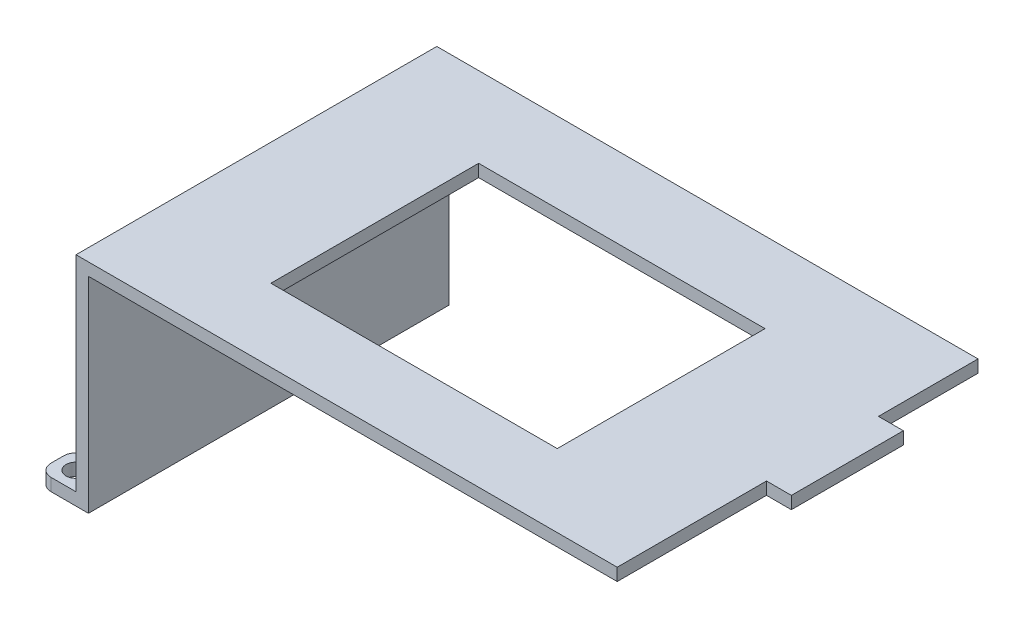
ISO-10303-21;
HEADER;
FILE_DESCRIPTION(('STEP AP214'),'2;1');
FILE_NAME('part.step','',(''),(''),'','','');
FILE_SCHEMA(('AUTOMOTIVE_DESIGN { 1 0 10303 214 1 1 1 1 }'));
ENDSEC;
DATA;
#1=APPLICATION_CONTEXT('core data for automotive mechanical design processes');
#2=APPLICATION_PROTOCOL_DEFINITION('international standard','automotive_design',2000,#1);
#3=PRODUCT_CONTEXT('',#1,'mechanical');
#4=PRODUCT('Part','Part','',(#3));
#5=PRODUCT_RELATED_PRODUCT_CATEGORY('part','',(#4));
#6=PRODUCT_DEFINITION_FORMATION('','',#4);
#7=PRODUCT_DEFINITION_CONTEXT('part definition',#1,'design');
#8=PRODUCT_DEFINITION('design','',#6,#7);
#9=PRODUCT_DEFINITION_SHAPE('','',#8);
#10=(LENGTH_UNIT() NAMED_UNIT(*) SI_UNIT(.MILLI.,.METRE.));
#11=(NAMED_UNIT(*) PLANE_ANGLE_UNIT() SI_UNIT($,.RADIAN.));
#12=(NAMED_UNIT(*) SI_UNIT($,.STERADIAN.) SOLID_ANGLE_UNIT());
#13=UNCERTAINTY_MEASURE_WITH_UNIT(LENGTH_MEASURE(1.E-05),#10,'distance_accuracy_value','');
#14=(GEOMETRIC_REPRESENTATION_CONTEXT(3) GLOBAL_UNCERTAINTY_ASSIGNED_CONTEXT((#13)) GLOBAL_UNIT_ASSIGNED_CONTEXT((#10,
#11,#12)) REPRESENTATION_CONTEXT('',''));
#15=CARTESIAN_POINT('',(0.,0.,0.));
#16=DIRECTION('',(0.,0.,1.));
#17=DIRECTION('',(1.,0.,0.));
#18=AXIS2_PLACEMENT_3D('',#15,#16,#17);
#19=CARTESIAN_POINT('',(-43.5,2.,0.));
#20=DIRECTION('',(-1.,0.,0.));
#21=DIRECTION('',(0.,0.,1.));
#22=AXIS2_PLACEMENT_3D('',#19,#20,#21);
#23=PLANE('',#22);
#24=DIRECTION('',(0.,-1.,0.));
#25=VECTOR('',#24,1.);
#26=CARTESIAN_POINT('',(-43.5,-31.,-23.));
#27=LINE('',#26,#25);
#28=CARTESIAN_POINT('',(-43.5,-31.,-23.));
#29=VERTEX_POINT('',#28);
#30=CARTESIAN_POINT('',(-43.5,-33.,-23.));
#31=VERTEX_POINT('',#30);
#32=EDGE_CURVE('E273',#29,#31,#27,.T.);
#33=ORIENTED_EDGE('',*,*,#32,.T.);
#34=DIRECTION('',(0.,0.,-1.));
#35=VECTOR('',#34,1.);
#36=CARTESIAN_POINT('',(-43.5,-33.,0.));
#37=LINE('',#36,#35);
#38=CARTESIAN_POINT('',(-43.5,-33.,23.));
#39=VERTEX_POINT('',#38);
#40=EDGE_CURVE('E339',#39,#31,#37,.T.);
#41=ORIENTED_EDGE('',*,*,#40,.F.);
#42=DIRECTION('',(0.,-1.,0.));
#43=VECTOR('',#42,1.);
#44=CARTESIAN_POINT('',(-43.5,-31.,23.));
#45=LINE('',#44,#43);
#46=CARTESIAN_POINT('',(-43.5,-31.,23.));
#47=VERTEX_POINT('',#46);
#48=EDGE_CURVE('E321',#47,#39,#45,.T.);
#49=ORIENTED_EDGE('',*,*,#48,.F.);
#50=DIRECTION('',(0.,0.,-1.));
#51=VECTOR('',#50,1.);
#52=CARTESIAN_POINT('',(-43.5,-31.,0.));
#53=LINE('',#52,#51);
#54=CARTESIAN_POINT('',(-43.5,-31.,29.));
#55=VERTEX_POINT('',#54);
#56=EDGE_CURVE('E304',#55,#47,#53,.T.);
#57=ORIENTED_EDGE('',*,*,#56,.F.);
#58=DIRECTION('',(0.,-1.,0.));
#59=VECTOR('',#58,1.);
#60=CARTESIAN_POINT('',(-43.5,2.,29.));
#61=LINE('',#60,#59);
#62=CARTESIAN_POINT('',(-43.5,2.,29.));
#63=VERTEX_POINT('',#62);
#64=EDGE_CURVE('E11',#63,#55,#61,.T.);
#65=ORIENTED_EDGE('',*,*,#64,.F.);
#66=DIRECTION('',(0.,0.,-1.));
#67=VECTOR('',#66,1.);
#68=CARTESIAN_POINT('',(-43.5,2.,0.));
#69=LINE('',#68,#67);
#70=CARTESIAN_POINT('',(-43.5,2.,-29.));
#71=VERTEX_POINT('',#70);
#72=EDGE_CURVE('E351',#63,#71,#69,.T.);
#73=ORIENTED_EDGE('',*,*,#72,.T.);
#74=DIRECTION('',(0.,-1.,0.));
#75=VECTOR('',#74,1.);
#76=CARTESIAN_POINT('',(-43.5,2.,-29.));
#77=LINE('',#76,#75);
#78=CARTESIAN_POINT('',(-43.5,-31.,-29.));
#79=VERTEX_POINT('',#78);
#80=EDGE_CURVE('E371',#71,#79,#77,.T.);
#81=ORIENTED_EDGE('',*,*,#80,.T.);
#82=DIRECTION('',(0.,0.,-1.));
#83=VECTOR('',#82,1.);
#84=CARTESIAN_POINT('',(-43.5,-31.,0.));
#85=LINE('',#84,#83);
#86=EDGE_CURVE('E256',#29,#79,#85,.T.);
#87=ORIENTED_EDGE('',*,*,#86,.F.);
#88=EDGE_LOOP('',(#33,#41,#49,#57,#65,#73,#81,#87));
#89=FACE_BOUND('',#88,.T.);
#90=ADVANCED_FACE('F41',(#89),#23,.T.);
#91=CARTESIAN_POINT('',(0.,2.,29.));
#92=DIRECTION('',(0.,0.,1.));
#93=DIRECTION('',(1.,0.,0.));
#94=AXIS2_PLACEMENT_3D('',#91,#92,#93);
#95=PLANE('',#94);
#96=DIRECTION('',(-1.,0.,0.));
#97=VECTOR('',#96,1.);
#98=CARTESIAN_POINT('',(0.,0.,29.));
#99=LINE('',#98,#97);
#100=CARTESIAN_POINT('',(43.5,0.,29.));
#101=VERTEX_POINT('',#100);
#102=CARTESIAN_POINT('',(-41.5,0.,29.));
#103=VERTEX_POINT('',#102);
#104=EDGE_CURVE('E350',#101,#103,#99,.T.);
#105=ORIENTED_EDGE('',*,*,#104,.F.);
#106=DIRECTION('',(0.,-1.,0.));
#107=VECTOR('',#106,1.);
#108=CARTESIAN_POINT('',(43.5,2.,29.));
#109=LINE('',#108,#107);
#110=CARTESIAN_POINT('',(43.5,2.,29.));
#111=VERTEX_POINT('',#110);
#112=EDGE_CURVE('E48',#111,#101,#109,.T.);
#113=ORIENTED_EDGE('',*,*,#112,.F.);
#114=DIRECTION('',(-1.,0.,0.));
#115=VECTOR('',#114,1.);
#116=CARTESIAN_POINT('',(0.,2.,29.));
#117=LINE('',#116,#115);
#118=EDGE_CURVE('E354',#111,#63,#117,.T.);
#119=ORIENTED_EDGE('',*,*,#118,.T.);
#120=ORIENTED_EDGE('',*,*,#64,.T.);
#121=DIRECTION('',(-1.,0.,0.));
#122=VECTOR('',#121,1.);
#123=CARTESIAN_POINT('',(0.,-31.,29.));
#124=LINE('',#123,#122);
#125=CARTESIAN_POINT('',(-47.5,-31.,29.));
#126=VERTEX_POINT('',#125);
#127=EDGE_CURVE('E289',#55,#126,#124,.T.);
#128=ORIENTED_EDGE('',*,*,#127,.T.);
#129=DIRECTION('',(0.,-1.,0.));
#130=VECTOR('',#129,1.);
#131=CARTESIAN_POINT('',(-47.5,-31.,29.));
#132=LINE('',#131,#130);
#133=CARTESIAN_POINT('',(-47.5,-33.,29.));
#134=VERTEX_POINT('',#133);
#135=EDGE_CURVE('E307',#126,#134,#132,.T.);
#136=ORIENTED_EDGE('',*,*,#135,.T.);
#137=DIRECTION('',(-1.,0.,0.));
#138=VECTOR('',#137,1.);
#139=CARTESIAN_POINT('',(0.,-33.,29.));
#140=LINE('',#139,#138);
#141=CARTESIAN_POINT('',(-41.5,-33.,29.));
#142=VERTEX_POINT('',#141);
#143=EDGE_CURVE('E337',#142,#134,#140,.T.);
#144=ORIENTED_EDGE('',*,*,#143,.F.);
#145=DIRECTION('',(0.,1.,0.));
#146=VECTOR('',#145,1.);
#147=CARTESIAN_POINT('',(-41.5,-33.,29.));
#148=LINE('',#147,#146);
#149=EDGE_CURVE('E348',#142,#103,#148,.T.);
#150=ORIENTED_EDGE('',*,*,#149,.T.);
#151=EDGE_LOOP('',(#105,#113,#119,#120,#128,#136,#144,#150));
#152=FACE_BOUND('',#151,.T.);
#153=ADVANCED_FACE('F410',(#152),#95,.T.);
#154=CARTESIAN_POINT('',(43.5,2.,0.));
#155=DIRECTION('',(-1.,0.,0.));
#156=DIRECTION('',(0.,0.,1.));
#157=AXIS2_PLACEMENT_3D('',#154,#155,#156);
#158=PLANE('',#157);
#159=DIRECTION('',(0.,0.,-1.));
#160=VECTOR('',#159,1.);
#161=CARTESIAN_POINT('',(43.5,0.,0.));
#162=LINE('',#161,#160);
#163=CARTESIAN_POINT('',(43.5,0.,5.00000000000002));
#164=VERTEX_POINT('',#163);
#165=EDGE_CURVE('E374',#101,#164,#162,.T.);
#166=ORIENTED_EDGE('',*,*,#165,.T.);
#167=DIRECTION('',(0.,-1.,0.));
#168=VECTOR('',#167,1.);
#169=CARTESIAN_POINT('',(43.5,2.,5.00000000000002));
#170=LINE('',#169,#168);
#171=CARTESIAN_POINT('',(43.5,2.,5.00000000000002));
#172=VERTEX_POINT('',#171);
#173=EDGE_CURVE('E399',#172,#164,#170,.T.);
#174=ORIENTED_EDGE('',*,*,#173,.F.);
#175=DIRECTION('',(0.,0.,-1.));
#176=VECTOR('',#175,1.);
#177=CARTESIAN_POINT('',(43.5,2.,0.));
#178=LINE('',#177,#176);
#179=EDGE_CURVE('E358',#111,#172,#178,.T.);
#180=ORIENTED_EDGE('',*,*,#179,.F.);
#181=ORIENTED_EDGE('',*,*,#112,.T.);
#182=EDGE_LOOP('',(#166,#174,#180,#181));
#183=FACE_BOUND('',#182,.T.);
#184=ADVANCED_FACE('F404',(#183),#158,.F.);
#185=CARTESIAN_POINT('',(0.,2.,5.00000000000002));
#186=DIRECTION('',(0.,0.,-1.));
#187=DIRECTION('',(-1.,0.,0.));
#188=AXIS2_PLACEMENT_3D('',#185,#186,#187);
#189=PLANE('',#188);
#190=DIRECTION('',(1.,0.,0.));
#191=VECTOR('',#190,1.);
#192=CARTESIAN_POINT('',(0.,0.,5.00000000000002));
#193=LINE('',#192,#191);
#194=CARTESIAN_POINT('',(47.5,0.,5.00000000000002));
#195=VERTEX_POINT('',#194);
#196=EDGE_CURVE('E376',#164,#195,#193,.T.);
#197=ORIENTED_EDGE('',*,*,#196,.T.);
#198=DIRECTION('',(0.,-1.,0.));
#199=VECTOR('',#198,1.);
#200=CARTESIAN_POINT('',(47.5,2.,5.00000000000002));
#201=LINE('',#200,#199);
#202=CARTESIAN_POINT('',(47.5,2.,5.00000000000002));
#203=VERTEX_POINT('',#202);
#204=EDGE_CURVE('E397',#203,#195,#201,.T.);
#205=ORIENTED_EDGE('',*,*,#204,.F.);
#206=DIRECTION('',(1.,0.,0.));
#207=VECTOR('',#206,1.);
#208=CARTESIAN_POINT('',(0.,2.,5.00000000000002));
#209=LINE('',#208,#207);
#210=EDGE_CURVE('E360',#172,#203,#209,.T.);
#211=ORIENTED_EDGE('',*,*,#210,.F.);
#212=ORIENTED_EDGE('',*,*,#173,.T.);
#213=EDGE_LOOP('',(#197,#205,#211,#212));
#214=FACE_BOUND('',#213,.T.);
#215=ADVANCED_FACE('F438',(#214),#189,.F.);
#216=CARTESIAN_POINT('',(47.5,2.,0.));
#217=DIRECTION('',(1.,0.,0.));
#218=DIRECTION('',(0.,0.,-1.));
#219=AXIS2_PLACEMENT_3D('',#216,#217,#218);
#220=PLANE('',#219);
#221=DIRECTION('',(0.,0.,1.));
#222=VECTOR('',#221,1.);
#223=CARTESIAN_POINT('',(47.5,0.,0.));
#224=LINE('',#223,#222);
#225=CARTESIAN_POINT('',(47.5,0.,-13.));
#226=VERTEX_POINT('',#225);
#227=EDGE_CURVE('E380',#226,#195,#224,.T.);
#228=ORIENTED_EDGE('',*,*,#227,.F.);
#229=DIRECTION('',(0.,-1.,0.));
#230=VECTOR('',#229,1.);
#231=CARTESIAN_POINT('',(47.5,2.,-13.));
#232=LINE('',#231,#230);
#233=CARTESIAN_POINT('',(47.5,2.,-13.));
#234=VERTEX_POINT('',#233);
#235=EDGE_CURVE('E395',#234,#226,#232,.T.);
#236=ORIENTED_EDGE('',*,*,#235,.F.);
#237=DIRECTION('',(0.,0.,1.));
#238=VECTOR('',#237,1.);
#239=CARTESIAN_POINT('',(47.5,2.,0.));
#240=LINE('',#239,#238);
#241=EDGE_CURVE('E363',#234,#203,#240,.T.);
#242=ORIENTED_EDGE('',*,*,#241,.T.);
#243=ORIENTED_EDGE('',*,*,#204,.T.);
#244=EDGE_LOOP('',(#228,#236,#242,#243));
#245=FACE_BOUND('',#244,.T.);
#246=ADVANCED_FACE('F434',(#245),#220,.T.);
#247=CARTESIAN_POINT('',(0.,2.,-13.));
#248=DIRECTION('',(0.,0.,-1.));
#249=DIRECTION('',(-1.,0.,0.));
#250=AXIS2_PLACEMENT_3D('',#247,#248,#249);
#251=PLANE('',#250);
#252=DIRECTION('',(1.,0.,0.));
#253=VECTOR('',#252,1.);
#254=CARTESIAN_POINT('',(0.,0.,-13.));
#255=LINE('',#254,#253);
#256=CARTESIAN_POINT('',(43.5,0.,-13.));
#257=VERTEX_POINT('',#256);
#258=EDGE_CURVE('E383',#257,#226,#255,.T.);
#259=ORIENTED_EDGE('',*,*,#258,.F.);
#260=DIRECTION('',(0.,-1.,0.));
#261=VECTOR('',#260,1.);
#262=CARTESIAN_POINT('',(43.5,2.,-13.));
#263=LINE('',#262,#261);
#264=CARTESIAN_POINT('',(43.5,2.,-13.));
#265=VERTEX_POINT('',#264);
#266=EDGE_CURVE('E393',#265,#257,#263,.T.);
#267=ORIENTED_EDGE('',*,*,#266,.F.);
#268=DIRECTION('',(1.,0.,0.));
#269=VECTOR('',#268,1.);
#270=CARTESIAN_POINT('',(0.,2.,-13.));
#271=LINE('',#270,#269);
#272=EDGE_CURVE('E366',#265,#234,#271,.T.);
#273=ORIENTED_EDGE('',*,*,#272,.T.);
#274=ORIENTED_EDGE('',*,*,#235,.T.);
#275=EDGE_LOOP('',(#259,#267,#273,#274));
#276=FACE_BOUND('',#275,.T.);
#277=ADVANCED_FACE('F430',(#276),#251,.T.);
#278=CARTESIAN_POINT('',(43.5,0.,-29.));
#279=VERTEX_POINT('',#278);
#280=EDGE_CURVE('E377',#257,#279,#162,.T.);
#281=ORIENTED_EDGE('',*,*,#280,.T.);
#282=DIRECTION('',(0.,-1.,0.));
#283=VECTOR('',#282,1.);
#284=CARTESIAN_POINT('',(43.5,2.,-29.));
#285=LINE('',#284,#283);
#286=CARTESIAN_POINT('',(43.5,2.,-29.));
#287=VERTEX_POINT('',#286);
#288=EDGE_CURVE('E390',#287,#279,#285,.T.);
#289=ORIENTED_EDGE('',*,*,#288,.F.);
#290=EDGE_CURVE('E361',#265,#287,#178,.T.);
#291=ORIENTED_EDGE('',*,*,#290,.F.);
#292=ORIENTED_EDGE('',*,*,#266,.T.);
#293=EDGE_LOOP('',(#281,#289,#291,#292));
#294=FACE_BOUND('',#293,.T.);
#295=ADVANCED_FACE('F426',(#294),#158,.F.);
#296=CARTESIAN_POINT('',(0.,2.,-29.));
#297=DIRECTION('',(0.,0.,1.));
#298=DIRECTION('',(1.,0.,0.));
#299=AXIS2_PLACEMENT_3D('',#296,#297,#298);
#300=PLANE('',#299);
#301=DIRECTION('',(-1.,0.,0.));
#302=VECTOR('',#301,1.);
#303=CARTESIAN_POINT('',(0.,0.,-29.));
#304=LINE('',#303,#302);
#305=CARTESIAN_POINT('',(-41.5,0.,-29.));
#306=VERTEX_POINT('',#305);
#307=EDGE_CURVE('E355',#279,#306,#304,.T.);
#308=ORIENTED_EDGE('',*,*,#307,.T.);
#309=DIRECTION('',(0.,1.,0.));
#310=VECTOR('',#309,1.);
#311=CARTESIAN_POINT('',(-41.5,-33.,-29.));
#312=LINE('',#311,#310);
#313=CARTESIAN_POINT('',(-41.5,-33.,-29.));
#314=VERTEX_POINT('',#313);
#315=EDGE_CURVE('E344',#314,#306,#312,.T.);
#316=ORIENTED_EDGE('',*,*,#315,.F.);
#317=DIRECTION('',(1.,0.,0.));
#318=VECTOR('',#317,1.);
#319=CARTESIAN_POINT('',(0.,-33.,-29.));
#320=LINE('',#319,#318);
#321=CARTESIAN_POINT('',(-47.5,-33.,-29.));
#322=VERTEX_POINT('',#321);
#323=EDGE_CURVE('E342',#322,#314,#320,.T.);
#324=ORIENTED_EDGE('',*,*,#323,.F.);
#325=DIRECTION('',(0.,-1.,0.));
#326=VECTOR('',#325,1.);
#327=CARTESIAN_POINT('',(-47.5,-31.,-29.));
#328=LINE('',#327,#326);
#329=CARTESIAN_POINT('',(-47.5,-31.,-29.));
#330=VERTEX_POINT('',#329);
#331=EDGE_CURVE('E277',#330,#322,#328,.T.);
#332=ORIENTED_EDGE('',*,*,#331,.F.);
#333=DIRECTION('',(-1.,0.,0.));
#334=VECTOR('',#333,1.);
#335=CARTESIAN_POINT('',(0.,-31.,-29.));
#336=LINE('',#335,#334);
#337=EDGE_CURVE('E253',#79,#330,#336,.T.);
#338=ORIENTED_EDGE('',*,*,#337,.F.);
#339=ORIENTED_EDGE('',*,*,#80,.F.);
#340=DIRECTION('',(-1.,0.,0.));
#341=VECTOR('',#340,1.);
#342=CARTESIAN_POINT('',(0.,2.,-29.));
#343=LINE('',#342,#341);
#344=EDGE_CURVE('E369',#287,#71,#343,.T.);
#345=ORIENTED_EDGE('',*,*,#344,.F.);
#346=ORIENTED_EDGE('',*,*,#288,.T.);
#347=EDGE_LOOP('',(#308,#316,#324,#332,#338,#339,#345,#346));
#348=FACE_BOUND('',#347,.T.);
#349=ADVANCED_FACE('F420',(#348),#300,.F.);
#350=CARTESIAN_POINT('',(0.,2.,0.));
#351=DIRECTION('',(0.,1.,0.));
#352=DIRECTION('',(0.,0.,1.));
#353=AXIS2_PLACEMENT_3D('',#350,#351,#352);
#354=PLANE('',#353);
#355=DIRECTION('',(0.,0.,1.));
#356=VECTOR('',#355,1.);
#357=CARTESIAN_POINT('',(-23.8691579893384,2.,17.3035636733516));
#358=LINE('',#357,#356);
#359=CARTESIAN_POINT('',(-23.8691579893384,2.,-16.0934126312213));
#360=VERTEX_POINT('',#359);
#361=CARTESIAN_POINT('',(-23.8691579893384,2.,17.3035636733516));
#362=VERTEX_POINT('',#361);
#363=EDGE_CURVE('E55',#360,#362,#358,.T.);
#364=ORIENTED_EDGE('',*,*,#363,.F.);
#365=DIRECTION('',(-1.,0.,0.));
#366=VECTOR('',#365,1.);
#367=CARTESIAN_POINT('',(-23.8691579893384,2.,-16.0934126312213));
#368=LINE('',#367,#366);
#369=CARTESIAN_POINT('',(22.1689913647083,2.,-16.0934126312213));
#370=VERTEX_POINT('',#369);
#371=EDGE_CURVE('E209',#370,#360,#368,.T.);
#372=ORIENTED_EDGE('',*,*,#371,.F.);
#373=DIRECTION('',(0.,0.,-1.));
#374=VECTOR('',#373,1.);
#375=CARTESIAN_POINT('',(22.1689913647083,2.,17.3035636733516));
#376=LINE('',#375,#374);
#377=CARTESIAN_POINT('',(22.1689913647083,2.,17.3035636733516));
#378=VERTEX_POINT('',#377);
#379=EDGE_CURVE('E229',#378,#370,#376,.T.);
#380=ORIENTED_EDGE('',*,*,#379,.F.);
#381=DIRECTION('',(1.,0.,0.));
#382=VECTOR('',#381,1.);
#383=CARTESIAN_POINT('',(-23.8691579893384,2.,17.3035636733516));
#384=LINE('',#383,#382);
#385=EDGE_CURVE('E223',#362,#378,#384,.T.);
#386=ORIENTED_EDGE('',*,*,#385,.F.);
#387=EDGE_LOOP('',(#364,#372,#380,#386));
#388=FACE_BOUND('',#387,.T.);
#389=ORIENTED_EDGE('',*,*,#72,.F.);
#390=ORIENTED_EDGE('',*,*,#118,.F.);
#391=ORIENTED_EDGE('',*,*,#179,.T.);
#392=ORIENTED_EDGE('',*,*,#210,.T.);
#393=ORIENTED_EDGE('',*,*,#241,.F.);
#394=ORIENTED_EDGE('',*,*,#272,.F.);
#395=ORIENTED_EDGE('',*,*,#290,.T.);
#396=ORIENTED_EDGE('',*,*,#344,.T.);
#397=EDGE_LOOP('',(#389,#390,#391,#392,#393,#394,#395,#396));
#398=FACE_BOUND('',#397,.T.);
#399=ADVANCED_FACE('F441',(#388,#398),#354,.T.);
#400=CARTESIAN_POINT('',(0.,0.,0.));
#401=DIRECTION('',(0.,1.,0.));
#402=DIRECTION('',(0.,0.,1.));
#403=AXIS2_PLACEMENT_3D('',#400,#401,#402);
#404=PLANE('',#403);
#405=DIRECTION('',(1.,0.,0.));
#406=VECTOR('',#405,1.);
#407=CARTESIAN_POINT('',(-23.8691579893384,0.,-16.0934126312213));
#408=LINE('',#407,#406);
#409=CARTESIAN_POINT('',(-23.8691579893384,0.,-16.0934126312213));
#410=VERTEX_POINT('',#409);
#411=CARTESIAN_POINT('',(22.1689913647083,0.,-16.0934126312213));
#412=VERTEX_POINT('',#411);
#413=EDGE_CURVE('E221',#410,#412,#408,.T.);
#414=ORIENTED_EDGE('',*,*,#413,.F.);
#415=DIRECTION('',(0.,0.,-1.));
#416=VECTOR('',#415,1.);
#417=CARTESIAN_POINT('',(-23.8691579893384,0.,17.3035636733516));
#418=LINE('',#417,#416);
#419=CARTESIAN_POINT('',(-23.8691579893384,0.,17.3035636733516));
#420=VERTEX_POINT('',#419);
#421=EDGE_CURVE('E203',#420,#410,#418,.T.);
#422=ORIENTED_EDGE('',*,*,#421,.F.);
#423=DIRECTION('',(-1.,0.,0.));
#424=VECTOR('',#423,1.);
#425=CARTESIAN_POINT('',(-23.8691579893384,0.,17.3035636733516));
#426=LINE('',#425,#424);
#427=CARTESIAN_POINT('',(22.1689913647083,0.,17.3035636733516));
#428=VERTEX_POINT('',#427);
#429=EDGE_CURVE('E212',#428,#420,#426,.T.);
#430=ORIENTED_EDGE('',*,*,#429,.F.);
#431=DIRECTION('',(0.,0.,1.));
#432=VECTOR('',#431,1.);
#433=CARTESIAN_POINT('',(22.1689913647083,0.,17.3035636733516));
#434=LINE('',#433,#432);
#435=EDGE_CURVE('E63',#412,#428,#434,.T.);
#436=ORIENTED_EDGE('',*,*,#435,.F.);
#437=EDGE_LOOP('',(#414,#422,#430,#436));
#438=FACE_BOUND('',#437,.T.);
#439=ORIENTED_EDGE('',*,*,#104,.T.);
#440=DIRECTION('',(0.,0.,-1.));
#441=VECTOR('',#440,1.);
#442=CARTESIAN_POINT('',(-41.5,0.,0.));
#443=LINE('',#442,#441);
#444=EDGE_CURVE('E324',#103,#306,#443,.T.);
#445=ORIENTED_EDGE('',*,*,#444,.T.);
#446=ORIENTED_EDGE('',*,*,#307,.F.);
#447=ORIENTED_EDGE('',*,*,#280,.F.);
#448=ORIENTED_EDGE('',*,*,#258,.T.);
#449=ORIENTED_EDGE('',*,*,#227,.T.);
#450=ORIENTED_EDGE('',*,*,#196,.F.);
#451=ORIENTED_EDGE('',*,*,#165,.F.);
#452=EDGE_LOOP('',(#439,#445,#446,#447,#448,#449,#450,#451));
#453=FACE_BOUND('',#452,.T.);
#454=ADVANCED_FACE('F218',(#438,#453),#404,.F.);
#455=CARTESIAN_POINT('',(-41.5,-33.,0.));
#456=DIRECTION('',(1.,0.,0.));
#457=DIRECTION('',(0.,0.,-1.));
#458=AXIS2_PLACEMENT_3D('',#455,#456,#457);
#459=PLANE('',#458);
#460=ORIENTED_EDGE('',*,*,#444,.F.);
#461=ORIENTED_EDGE('',*,*,#149,.F.);
#462=DIRECTION('',(0.,0.,-1.));
#463=VECTOR('',#462,1.);
#464=CARTESIAN_POINT('',(-41.5,-33.,0.));
#465=LINE('',#464,#463);
#466=EDGE_CURVE('E334',#142,#314,#465,.T.);
#467=ORIENTED_EDGE('',*,*,#466,.T.);
#468=ORIENTED_EDGE('',*,*,#315,.T.);
#469=EDGE_LOOP('',(#460,#461,#467,#468));
#470=FACE_BOUND('',#469,.T.);
#471=ADVANCED_FACE('F415',(#470),#459,.T.);
#472=CARTESIAN_POINT('',(0.,-33.,0.));
#473=DIRECTION('',(0.,-1.,0.));
#474=DIRECTION('',(0.,0.,-1.));
#475=AXIS2_PLACEMENT_3D('',#472,#473,#474);
#476=PLANE('',#475);
#477=ORIENTED_EDGE('',*,*,#466,.F.);
#478=ORIENTED_EDGE('',*,*,#143,.T.);
#479=CARTESIAN_POINT('',(-47.5,-33.,27.));
#480=DIRECTION('',(0.,-1.,0.));
#481=DIRECTION('',(0.,0.,-1.));
#482=AXIS2_PLACEMENT_3D('',#479,#480,#481);
#483=CIRCLE('',#482,2.);
#484=CARTESIAN_POINT('',(-49.5,-33.,27.));
#485=VERTEX_POINT('',#484);
#486=EDGE_CURVE('E310',#134,#485,#483,.T.);
#487=ORIENTED_EDGE('',*,*,#486,.T.);
#488=DIRECTION('',(0.,0.,-1.));
#489=VECTOR('',#488,1.);
#490=CARTESIAN_POINT('',(-49.5,-33.,0.));
#491=LINE('',#490,#489);
#492=CARTESIAN_POINT('',(-49.5,-33.,25.));
#493=VERTEX_POINT('',#492);
#494=EDGE_CURVE('E313',#485,#493,#491,.T.);
#495=ORIENTED_EDGE('',*,*,#494,.T.);
#496=CARTESIAN_POINT('',(-47.5,-33.,25.));
#497=DIRECTION('',(0.,-1.,0.));
#498=DIRECTION('',(0.,0.,-1.));
#499=AXIS2_PLACEMENT_3D('',#496,#497,#498);
#500=CIRCLE('',#499,2.);
#501=CARTESIAN_POINT('',(-47.5,-33.,23.));
#502=VERTEX_POINT('',#501);
#503=EDGE_CURVE('E316',#502,#493,#500,.F.);
#504=ORIENTED_EDGE('',*,*,#503,.F.);
#505=DIRECTION('',(-1.,0.,0.));
#506=VECTOR('',#505,1.);
#507=CARTESIAN_POINT('',(0.,-33.,23.));
#508=LINE('',#507,#506);
#509=EDGE_CURVE('E290',#39,#502,#508,.T.);
#510=ORIENTED_EDGE('',*,*,#509,.F.);
#511=ORIENTED_EDGE('',*,*,#40,.T.);
#512=DIRECTION('',(-1.,0.,0.));
#513=VECTOR('',#512,1.);
#514=CARTESIAN_POINT('',(0.,-33.,-23.));
#515=LINE('',#514,#513);
#516=CARTESIAN_POINT('',(-47.5,-33.,-23.));
#517=VERTEX_POINT('',#516);
#518=EDGE_CURVE('E262',#31,#517,#515,.T.);
#519=ORIENTED_EDGE('',*,*,#518,.T.);
#520=CARTESIAN_POINT('',(-47.5,-33.,-25.));
#521=DIRECTION('',(0.,-1.,0.));
#522=DIRECTION('',(0.,0.,-1.));
#523=AXIS2_PLACEMENT_3D('',#520,#521,#522);
#524=CIRCLE('',#523,2.);
#525=CARTESIAN_POINT('',(-49.5,-33.,-25.));
#526=VERTEX_POINT('',#525);
#527=EDGE_CURVE('E265',#517,#526,#524,.T.);
#528=ORIENTED_EDGE('',*,*,#527,.T.);
#529=DIRECTION('',(0.,0.,1.));
#530=VECTOR('',#529,1.);
#531=CARTESIAN_POINT('',(-49.5,-33.,0.));
#532=LINE('',#531,#530);
#533=CARTESIAN_POINT('',(-49.5,-33.,-27.));
#534=VERTEX_POINT('',#533);
#535=EDGE_CURVE('E268',#534,#526,#532,.T.);
#536=ORIENTED_EDGE('',*,*,#535,.F.);
#537=CARTESIAN_POINT('',(-47.5,-33.,-27.));
#538=DIRECTION('',(0.,-1.,0.));
#539=DIRECTION('',(0.,0.,-1.));
#540=AXIS2_PLACEMENT_3D('',#537,#538,#539);
#541=CIRCLE('',#540,2.);
#542=EDGE_CURVE('E242',#322,#534,#541,.F.);
#543=ORIENTED_EDGE('',*,*,#542,.F.);
#544=ORIENTED_EDGE('',*,*,#323,.T.);
#545=EDGE_LOOP('',(#477,#478,#487,#495,#504,#510,#511,#519,#528,#536,#543,#544));
#546=FACE_BOUND('',#545,.T.);
#547=CARTESIAN_POINT('',(-46.5,-33.,26.));
#548=DIRECTION('',(0.,-1.,0.));
#549=DIRECTION('',(0.,0.,-1.));
#550=AXIS2_PLACEMENT_3D('',#547,#548,#549);
#551=CIRCLE('',#550,1.6);
#552=CARTESIAN_POINT('',(-46.5,-33.,24.4));
#553=VERTEX_POINT('',#552);
#554=EDGE_CURVE('E276',#553,#553,#551,.T.);
#555=ORIENTED_EDGE('',*,*,#554,.F.);
#556=EDGE_LOOP('',(#555));
#557=FACE_BOUND('',#556,.T.);
#558=CARTESIAN_POINT('',(-46.5,-33.,-26.));
#559=DIRECTION('',(0.,-1.,0.));
#560=DIRECTION('',(0.,0.,-1.));
#561=AXIS2_PLACEMENT_3D('',#558,#559,#560);
#562=CIRCLE('',#561,1.6);
#563=CARTESIAN_POINT('',(-46.5,-33.,-27.6));
#564=VERTEX_POINT('',#563);
#565=EDGE_CURVE('E215',#564,#564,#562,.T.);
#566=ORIENTED_EDGE('',*,*,#565,.F.);
#567=EDGE_LOOP('',(#566));
#568=FACE_BOUND('',#567,.T.);
#569=ADVANCED_FACE('F453',(#546,#557,#568),#476,.T.);
#570=CARTESIAN_POINT('',(0.,-31.,23.));
#571=DIRECTION('',(0.,0.,1.));
#572=DIRECTION('',(1.,0.,0.));
#573=AXIS2_PLACEMENT_3D('',#570,#571,#572);
#574=PLANE('',#573);
#575=ORIENTED_EDGE('',*,*,#509,.T.);
#576=DIRECTION('',(0.,-1.,0.));
#577=VECTOR('',#576,1.);
#578=CARTESIAN_POINT('',(-47.5,-31.,23.));
#579=LINE('',#578,#577);
#580=CARTESIAN_POINT('',(-47.5,-31.,23.));
#581=VERTEX_POINT('',#580);
#582=EDGE_CURVE('E325',#581,#502,#579,.T.);
#583=ORIENTED_EDGE('',*,*,#582,.F.);
#584=DIRECTION('',(-1.,0.,0.));
#585=VECTOR('',#584,1.);
#586=CARTESIAN_POINT('',(0.,-31.,23.));
#587=LINE('',#586,#585);
#588=EDGE_CURVE('E301',#47,#581,#587,.T.);
#589=ORIENTED_EDGE('',*,*,#588,.F.);
#590=ORIENTED_EDGE('',*,*,#48,.T.);
#591=EDGE_LOOP('',(#575,#583,#589,#590));
#592=FACE_BOUND('',#591,.T.);
#593=ADVANCED_FACE('F492',(#592),#574,.F.);
#594=CARTESIAN_POINT('',(-47.5,-31.,25.));
#595=DIRECTION('',(0.,-1.,0.));
#596=DIRECTION('',(0.,0.,-1.));
#597=AXIS2_PLACEMENT_3D('',#594,#595,#596);
#598=CYLINDRICAL_SURFACE('',#597,2.);
#599=ORIENTED_EDGE('',*,*,#503,.T.);
#600=DIRECTION('',(0.,-1.,0.));
#601=VECTOR('',#600,1.);
#602=CARTESIAN_POINT('',(-49.5,-31.,25.));
#603=LINE('',#602,#601);
#604=CARTESIAN_POINT('',(-49.5,-31.,25.));
#605=VERTEX_POINT('',#604);
#606=EDGE_CURVE('E328',#605,#493,#603,.T.);
#607=ORIENTED_EDGE('',*,*,#606,.F.);
#608=CARTESIAN_POINT('',(-47.5,-31.,25.));
#609=DIRECTION('',(0.,-1.,0.));
#610=DIRECTION('',(0.,0.,-1.));
#611=AXIS2_PLACEMENT_3D('',#608,#609,#610);
#612=CIRCLE('',#611,2.);
#613=EDGE_CURVE('E299',#581,#605,#612,.F.);
#614=ORIENTED_EDGE('',*,*,#613,.F.);
#615=ORIENTED_EDGE('',*,*,#582,.T.);
#616=EDGE_LOOP('',(#599,#607,#614,#615));
#617=FACE_BOUND('',#616,.T.);
#618=ADVANCED_FACE('F502',(#617),#598,.T.);
#619=CARTESIAN_POINT('',(-49.5,-31.,0.));
#620=DIRECTION('',(-1.,0.,0.));
#621=DIRECTION('',(0.,0.,1.));
#622=AXIS2_PLACEMENT_3D('',#619,#620,#621);
#623=PLANE('',#622);
#624=ORIENTED_EDGE('',*,*,#494,.F.);
#625=DIRECTION('',(0.,-1.,0.));
#626=VECTOR('',#625,1.);
#627=CARTESIAN_POINT('',(-49.5,-31.,27.));
#628=LINE('',#627,#626);
#629=CARTESIAN_POINT('',(-49.5,-31.,27.));
#630=VERTEX_POINT('',#629);
#631=EDGE_CURVE('E330',#630,#485,#628,.T.);
#632=ORIENTED_EDGE('',*,*,#631,.F.);
#633=DIRECTION('',(0.,0.,-1.));
#634=VECTOR('',#633,1.);
#635=CARTESIAN_POINT('',(-49.5,-31.,0.));
#636=LINE('',#635,#634);
#637=EDGE_CURVE('E296',#630,#605,#636,.T.);
#638=ORIENTED_EDGE('',*,*,#637,.T.);
#639=ORIENTED_EDGE('',*,*,#606,.T.);
#640=EDGE_LOOP('',(#624,#632,#638,#639));
#641=FACE_BOUND('',#640,.T.);
#642=ADVANCED_FACE('F496',(#641),#623,.T.);
#643=CARTESIAN_POINT('',(-46.5,-31.,26.));
#644=DIRECTION('',(0.,-1.,0.));
#645=DIRECTION('',(0.,0.,-1.));
#646=AXIS2_PLACEMENT_3D('',#643,#644,#645);
#647=CYLINDRICAL_SURFACE('',#646,1.6);
#648=CARTESIAN_POINT('',(-46.5,-31.,26.));
#649=DIRECTION('',(0.,-1.,0.));
#650=DIRECTION('',(0.,0.,-1.));
#651=AXIS2_PLACEMENT_3D('',#648,#649,#650);
#652=CIRCLE('',#651,1.6);
#653=CARTESIAN_POINT('',(-46.5,-31.,24.4));
#654=VERTEX_POINT('',#653);
#655=EDGE_CURVE('E286',#654,#654,#652,.T.);
#656=ORIENTED_EDGE('',*,*,#655,.F.);
#657=EDGE_LOOP('',(#656));
#658=FACE_BOUND('',#657,.T.);
#659=ORIENTED_EDGE('',*,*,#554,.T.);
#660=EDGE_LOOP('',(#659));
#661=FACE_BOUND('',#660,.T.);
#662=ADVANCED_FACE('F493',(#658,#661),#647,.F.);
#663=CARTESIAN_POINT('',(-47.5,-31.,27.));
#664=DIRECTION('',(0.,-1.,0.));
#665=DIRECTION('',(0.,0.,-1.));
#666=AXIS2_PLACEMENT_3D('',#663,#664,#665);
#667=CYLINDRICAL_SURFACE('',#666,2.);
#668=ORIENTED_EDGE('',*,*,#486,.F.);
#669=ORIENTED_EDGE('',*,*,#135,.F.);
#670=CARTESIAN_POINT('',(-47.5,-31.,27.));
#671=DIRECTION('',(0.,-1.,0.));
#672=DIRECTION('',(0.,0.,-1.));
#673=AXIS2_PLACEMENT_3D('',#670,#671,#672);
#674=CIRCLE('',#673,2.);
#675=EDGE_CURVE('E293',#126,#630,#674,.T.);
#676=ORIENTED_EDGE('',*,*,#675,.T.);
#677=ORIENTED_EDGE('',*,*,#631,.T.);
#678=EDGE_LOOP('',(#668,#669,#676,#677));
#679=FACE_BOUND('',#678,.T.);
#680=ADVANCED_FACE('F450',(#679),#667,.T.);
#681=CARTESIAN_POINT('',(0.,-31.,0.));
#682=DIRECTION('',(0.,-1.,0.));
#683=DIRECTION('',(0.,0.,-1.));
#684=AXIS2_PLACEMENT_3D('',#681,#682,#683);
#685=PLANE('',#684);
#686=ORIENTED_EDGE('',*,*,#655,.T.);
#687=EDGE_LOOP('',(#686));
#688=FACE_BOUND('',#687,.T.);
#689=ORIENTED_EDGE('',*,*,#127,.F.);
#690=ORIENTED_EDGE('',*,*,#56,.T.);
#691=ORIENTED_EDGE('',*,*,#588,.T.);
#692=ORIENTED_EDGE('',*,*,#613,.T.);
#693=ORIENTED_EDGE('',*,*,#637,.F.);
#694=ORIENTED_EDGE('',*,*,#675,.F.);
#695=EDGE_LOOP('',(#689,#690,#691,#692,#693,#694));
#696=FACE_BOUND('',#695,.T.);
#697=ADVANCED_FACE('F446',(#688,#696),#685,.F.);
#698=CARTESIAN_POINT('',(0.,-31.,-23.));
#699=DIRECTION('',(0.,0.,1.));
#700=DIRECTION('',(1.,0.,0.));
#701=AXIS2_PLACEMENT_3D('',#698,#699,#700);
#702=PLANE('',#701);
#703=ORIENTED_EDGE('',*,*,#518,.F.);
#704=ORIENTED_EDGE('',*,*,#32,.F.);
#705=DIRECTION('',(-1.,0.,0.));
#706=VECTOR('',#705,1.);
#707=CARTESIAN_POINT('',(0.,-31.,-23.));
#708=LINE('',#707,#706);
#709=CARTESIAN_POINT('',(-47.5,-31.,-23.));
#710=VERTEX_POINT('',#709);
#711=EDGE_CURVE('E241',#29,#710,#708,.T.);
#712=ORIENTED_EDGE('',*,*,#711,.T.);
#713=DIRECTION('',(0.,-1.,0.));
#714=VECTOR('',#713,1.);
#715=CARTESIAN_POINT('',(-47.5,-31.,-23.));
#716=LINE('',#715,#714);
#717=EDGE_CURVE('E259',#710,#517,#716,.T.);
#718=ORIENTED_EDGE('',*,*,#717,.T.);
#719=EDGE_LOOP('',(#703,#704,#712,#718));
#720=FACE_BOUND('',#719,.T.);
#721=ADVANCED_FACE('F512',(#720),#702,.T.);
#722=CARTESIAN_POINT('',(-47.5,-31.,-27.));
#723=DIRECTION('',(0.,-1.,0.));
#724=DIRECTION('',(0.,0.,-1.));
#725=AXIS2_PLACEMENT_3D('',#722,#723,#724);
#726=CYLINDRICAL_SURFACE('',#725,2.);
#727=ORIENTED_EDGE('',*,*,#542,.T.);
#728=DIRECTION('',(0.,-1.,0.));
#729=VECTOR('',#728,1.);
#730=CARTESIAN_POINT('',(-49.5,-31.,-27.));
#731=LINE('',#730,#729);
#732=CARTESIAN_POINT('',(-49.5,-31.,-27.));
#733=VERTEX_POINT('',#732);
#734=EDGE_CURVE('E280',#733,#534,#731,.T.);
#735=ORIENTED_EDGE('',*,*,#734,.F.);
#736=CARTESIAN_POINT('',(-47.5,-31.,-27.));
#737=DIRECTION('',(0.,-1.,0.));
#738=DIRECTION('',(0.,0.,-1.));
#739=AXIS2_PLACEMENT_3D('',#736,#737,#738);
#740=CIRCLE('',#739,2.);
#741=EDGE_CURVE('E250',#330,#733,#740,.F.);
#742=ORIENTED_EDGE('',*,*,#741,.F.);
#743=ORIENTED_EDGE('',*,*,#331,.T.);
#744=EDGE_LOOP('',(#727,#735,#742,#743));
#745=FACE_BOUND('',#744,.T.);
#746=ADVANCED_FACE('F458',(#745),#726,.T.);
#747=CARTESIAN_POINT('',(-49.5,-31.,0.));
#748=DIRECTION('',(1.,0.,0.));
#749=DIRECTION('',(0.,0.,-1.));
#750=AXIS2_PLACEMENT_3D('',#747,#748,#749);
#751=PLANE('',#750);
#752=ORIENTED_EDGE('',*,*,#535,.T.);
#753=DIRECTION('',(0.,-1.,0.));
#754=VECTOR('',#753,1.);
#755=CARTESIAN_POINT('',(-49.5,-31.,-25.));
#756=LINE('',#755,#754);
#757=CARTESIAN_POINT('',(-49.5,-31.,-25.));
#758=VERTEX_POINT('',#757);
#759=EDGE_CURVE('E283',#758,#526,#756,.T.);
#760=ORIENTED_EDGE('',*,*,#759,.F.);
#761=DIRECTION('',(0.,0.,1.));
#762=VECTOR('',#761,1.);
#763=CARTESIAN_POINT('',(-49.5,-31.,0.));
#764=LINE('',#763,#762);
#765=EDGE_CURVE('E248',#733,#758,#764,.T.);
#766=ORIENTED_EDGE('',*,*,#765,.F.);
#767=ORIENTED_EDGE('',*,*,#734,.T.);
#768=EDGE_LOOP('',(#752,#760,#766,#767));
#769=FACE_BOUND('',#768,.T.);
#770=ADVANCED_FACE('F518',(#769),#751,.F.);
#771=CARTESIAN_POINT('',(-46.5,-31.,-26.));
#772=DIRECTION('',(0.,-1.,0.));
#773=DIRECTION('',(0.,0.,-1.));
#774=AXIS2_PLACEMENT_3D('',#771,#772,#773);
#775=CYLINDRICAL_SURFACE('',#774,1.6);
#776=CARTESIAN_POINT('',(-46.5,-31.,-26.));
#777=DIRECTION('',(0.,-1.,0.));
#778=DIRECTION('',(0.,0.,-1.));
#779=AXIS2_PLACEMENT_3D('',#776,#777,#778);
#780=CIRCLE('',#779,1.6);
#781=CARTESIAN_POINT('',(-46.5,-31.,-27.6));
#782=VERTEX_POINT('',#781);
#783=EDGE_CURVE('E238',#782,#782,#780,.T.);
#784=ORIENTED_EDGE('',*,*,#783,.F.);
#785=EDGE_LOOP('',(#784));
#786=FACE_BOUND('',#785,.T.);
#787=ORIENTED_EDGE('',*,*,#565,.T.);
#788=EDGE_LOOP('',(#787));
#789=FACE_BOUND('',#788,.T.);
#790=ADVANCED_FACE('F514',(#786,#789),#775,.F.);
#791=CARTESIAN_POINT('',(-47.5,-31.,-25.));
#792=DIRECTION('',(0.,-1.,0.));
#793=DIRECTION('',(0.,0.,-1.));
#794=AXIS2_PLACEMENT_3D('',#791,#792,#793);
#795=CYLINDRICAL_SURFACE('',#794,2.);
#796=ORIENTED_EDGE('',*,*,#527,.F.);
#797=ORIENTED_EDGE('',*,*,#717,.F.);
#798=CARTESIAN_POINT('',(-47.5,-31.,-25.));
#799=DIRECTION('',(0.,-1.,0.));
#800=DIRECTION('',(0.,0.,-1.));
#801=AXIS2_PLACEMENT_3D('',#798,#799,#800);
#802=CIRCLE('',#801,2.);
#803=EDGE_CURVE('E245',#710,#758,#802,.T.);
#804=ORIENTED_EDGE('',*,*,#803,.T.);
#805=ORIENTED_EDGE('',*,*,#759,.T.);
#806=EDGE_LOOP('',(#796,#797,#804,#805));
#807=FACE_BOUND('',#806,.T.);
#808=ADVANCED_FACE('F517',(#807),#795,.T.);
#809=CARTESIAN_POINT('',(0.,-31.,0.));
#810=DIRECTION('',(0.,-1.,0.));
#811=DIRECTION('',(0.,0.,-1.));
#812=AXIS2_PLACEMENT_3D('',#809,#810,#811);
#813=PLANE('',#812);
#814=ORIENTED_EDGE('',*,*,#783,.T.);
#815=EDGE_LOOP('',(#814));
#816=FACE_BOUND('',#815,.T.);
#817=ORIENTED_EDGE('',*,*,#711,.F.);
#818=ORIENTED_EDGE('',*,*,#86,.T.);
#819=ORIENTED_EDGE('',*,*,#337,.T.);
#820=ORIENTED_EDGE('',*,*,#741,.T.);
#821=ORIENTED_EDGE('',*,*,#765,.T.);
#822=ORIENTED_EDGE('',*,*,#803,.F.);
#823=EDGE_LOOP('',(#817,#818,#819,#820,#821,#822));
#824=FACE_BOUND('',#823,.T.);
#825=ADVANCED_FACE('F462',(#816,#824),#813,.F.);
#826=CARTESIAN_POINT('',(-23.8691579893384,-33.001,17.3035636733516));
#827=DIRECTION('',(-1.,0.,0.));
#828=DIRECTION('',(0.,0.,1.));
#829=AXIS2_PLACEMENT_3D('',#826,#827,#828);
#830=PLANE('',#829);
#831=ORIENTED_EDGE('',*,*,#421,.T.);
#832=DIRECTION('',(0.,1.,0.));
#833=VECTOR('',#832,1.);
#834=CARTESIAN_POINT('',(-23.8691579893384,-33.001,-16.0934126312213));
#835=LINE('',#834,#833);
#836=EDGE_CURVE('E216',#410,#360,#835,.T.);
#837=ORIENTED_EDGE('',*,*,#836,.T.);
#838=ORIENTED_EDGE('',*,*,#363,.T.);
#839=DIRECTION('',(0.,1.,0.));
#840=VECTOR('',#839,1.);
#841=CARTESIAN_POINT('',(-23.8691579893384,-33.001,17.3035636733516));
#842=LINE('',#841,#840);
#843=EDGE_CURVE('E199',#420,#362,#842,.T.);
#844=ORIENTED_EDGE('',*,*,#843,.F.);
#845=EDGE_LOOP('',(#831,#837,#838,#844));
#846=FACE_BOUND('',#845,.T.);
#847=ADVANCED_FACE('F201',(#846),#830,.F.);
#848=CARTESIAN_POINT('',(-23.8691579893384,-33.001,-16.0934126312213));
#849=DIRECTION('',(0.,0.,-1.));
#850=DIRECTION('',(-1.,0.,0.));
#851=AXIS2_PLACEMENT_3D('',#848,#849,#850);
#852=PLANE('',#851);
#853=ORIENTED_EDGE('',*,*,#413,.T.);
#854=DIRECTION('',(0.,1.,0.));
#855=VECTOR('',#854,1.);
#856=CARTESIAN_POINT('',(22.1689913647083,-33.001,-16.0934126312213));
#857=LINE('',#856,#855);
#858=EDGE_CURVE('E235',#412,#370,#857,.T.);
#859=ORIENTED_EDGE('',*,*,#858,.T.);
#860=ORIENTED_EDGE('',*,*,#371,.T.);
#861=ORIENTED_EDGE('',*,*,#836,.F.);
#862=EDGE_LOOP('',(#853,#859,#860,#861));
#863=FACE_BOUND('',#862,.T.);
#864=ADVANCED_FACE('F536',(#863),#852,.F.);
#865=CARTESIAN_POINT('',(22.1689913647083,-33.001,17.3035636733516));
#866=DIRECTION('',(1.,0.,0.));
#867=DIRECTION('',(0.,0.,-1.));
#868=AXIS2_PLACEMENT_3D('',#865,#866,#867);
#869=PLANE('',#868);
#870=ORIENTED_EDGE('',*,*,#435,.T.);
#871=DIRECTION('',(0.,1.,0.));
#872=VECTOR('',#871,1.);
#873=CARTESIAN_POINT('',(22.1689913647083,-33.001,17.3035636733516));
#874=LINE('',#873,#872);
#875=EDGE_CURVE('E208',#428,#378,#874,.T.);
#876=ORIENTED_EDGE('',*,*,#875,.T.);
#877=ORIENTED_EDGE('',*,*,#379,.T.);
#878=ORIENTED_EDGE('',*,*,#858,.F.);
#879=EDGE_LOOP('',(#870,#876,#877,#878));
#880=FACE_BOUND('',#879,.T.);
#881=ADVANCED_FACE('F539',(#880),#869,.F.);
#882=CARTESIAN_POINT('',(-23.8691579893384,-33.001,17.3035636733516));
#883=DIRECTION('',(0.,0.,1.));
#884=DIRECTION('',(1.,0.,0.));
#885=AXIS2_PLACEMENT_3D('',#882,#883,#884);
#886=PLANE('',#885);
#887=ORIENTED_EDGE('',*,*,#429,.T.);
#888=ORIENTED_EDGE('',*,*,#843,.T.);
#889=ORIENTED_EDGE('',*,*,#385,.T.);
#890=ORIENTED_EDGE('',*,*,#875,.F.);
#891=EDGE_LOOP('',(#887,#888,#889,#890));
#892=FACE_BOUND('',#891,.T.);
#893=ADVANCED_FACE('F213',(#892),#886,.F.);
#894=CLOSED_SHELL('',(#90,#153,#184,#215,#246,#277,#295,#349,#399,#454,#471,#569,#593,#618,#642,
#662,#680,#697,#721,#746,#770,#790,#808,#825,#847,#864,#881,#893));
#895=MANIFOLD_SOLID_BREP('B2',#894);
#896=ADVANCED_BREP_SHAPE_REPRESENTATION('',(#18,#895),#14);
#897=SHAPE_DEFINITION_REPRESENTATION(#9,#896);
ENDSEC;
END-ISO-10303-21;
